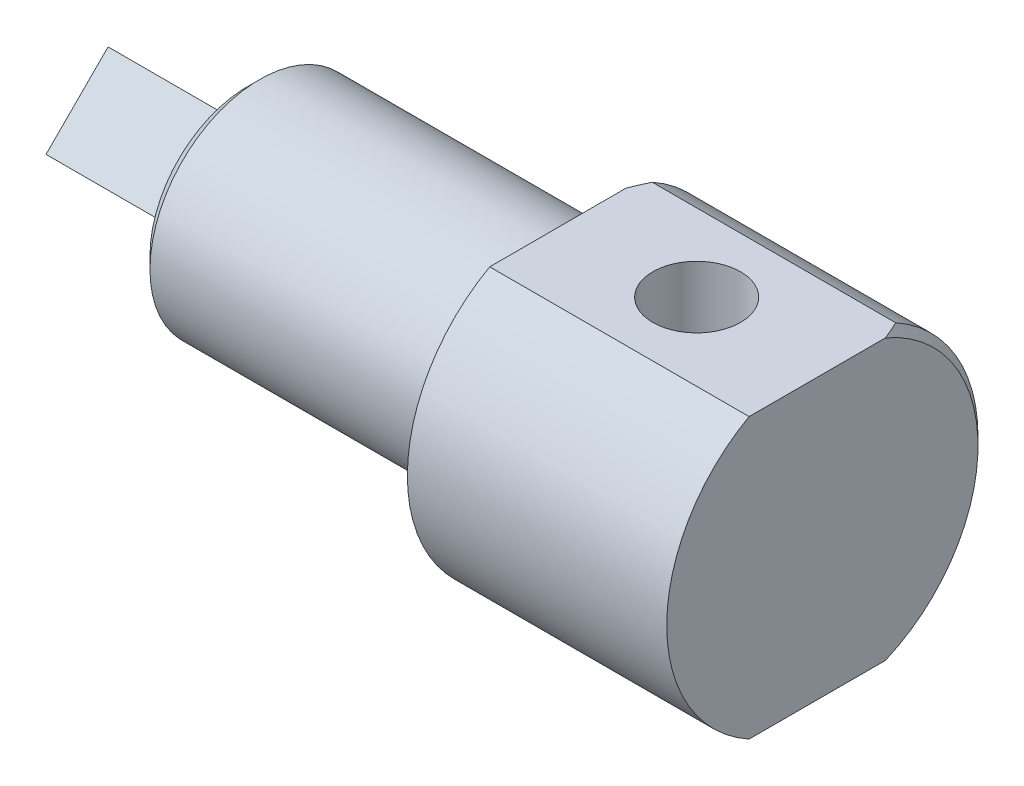
ISO-10303-21;
HEADER;
FILE_DESCRIPTION(('STEP AP214'),'2;1');
FILE_NAME('part.step','',(''),(''),'','','');
FILE_SCHEMA(('AUTOMOTIVE_DESIGN { 1 0 10303 214 1 1 1 1 }'));
ENDSEC;
DATA;
#1=APPLICATION_CONTEXT('core data for automotive mechanical design processes');
#2=APPLICATION_PROTOCOL_DEFINITION('international standard','automotive_design',2000,#1);
#3=PRODUCT_CONTEXT('',#1,'mechanical');
#4=PRODUCT('Part','Part','',(#3));
#5=PRODUCT_RELATED_PRODUCT_CATEGORY('part','',(#4));
#6=PRODUCT_DEFINITION_FORMATION('','',#4);
#7=PRODUCT_DEFINITION_CONTEXT('part definition',#1,'design');
#8=PRODUCT_DEFINITION('design','',#6,#7);
#9=PRODUCT_DEFINITION_SHAPE('','',#8);
#10=(LENGTH_UNIT() NAMED_UNIT(*) SI_UNIT(.MILLI.,.METRE.));
#11=(NAMED_UNIT(*) PLANE_ANGLE_UNIT() SI_UNIT($,.RADIAN.));
#12=(NAMED_UNIT(*) SI_UNIT($,.STERADIAN.) SOLID_ANGLE_UNIT());
#13=UNCERTAINTY_MEASURE_WITH_UNIT(LENGTH_MEASURE(1.E-05),#10,'distance_accuracy_value','');
#14=(GEOMETRIC_REPRESENTATION_CONTEXT(3) GLOBAL_UNCERTAINTY_ASSIGNED_CONTEXT((#13)) GLOBAL_UNIT_ASSIGNED_CONTEXT((#10,
#11,#12)) REPRESENTATION_CONTEXT('',''));
#15=CARTESIAN_POINT('',(0.,0.,0.));
#16=DIRECTION('',(0.,0.,1.));
#17=DIRECTION('',(1.,0.,0.));
#18=AXIS2_PLACEMENT_3D('',#15,#16,#17);
#19=CARTESIAN_POINT('',(0.,0.,0.));
#20=DIRECTION('',(1.,0.,0.));
#21=DIRECTION('',(0.,0.,-1.));
#22=AXIS2_PLACEMENT_3D('',#19,#20,#21);
#23=CYLINDRICAL_SURFACE('',#22,40.);
#24=DIRECTION('',(-1.,0.,0.));
#25=VECTOR('',#24,1.);
#26=CARTESIAN_POINT('',(489.715486354475,-35.,19.3649167310371));
#27=LINE('',#26,#25);
#28=CARTESIAN_POINT('',(145.,-35.,19.3649167310371));
#29=VERTEX_POINT('',#28);
#30=CARTESIAN_POINT('',(80.,-35.,19.3649167310371));
#31=VERTEX_POINT('',#30);
#32=EDGE_CURVE('E141',#29,#31,#27,.T.);
#33=ORIENTED_EDGE('',*,*,#32,.F.);
#34=CARTESIAN_POINT('',(145.,0.,0.));
#35=DIRECTION('',(1.,0.,0.));
#36=DIRECTION('',(0.,0.,-1.));
#37=AXIS2_PLACEMENT_3D('',#34,#35,#36);
#38=CIRCLE('',#37,40.);
#39=CARTESIAN_POINT('',(145.,35.,19.3649167310371));
#40=VERTEX_POINT('',#39);
#41=EDGE_CURVE('E151',#40,#29,#38,.T.);
#42=ORIENTED_EDGE('',*,*,#41,.F.);
#43=DIRECTION('',(-1.,0.,0.));
#44=VECTOR('',#43,1.);
#45=CARTESIAN_POINT('',(592.003645318366,35.,19.3649167310371));
#46=LINE('',#45,#44);
#47=CARTESIAN_POINT('',(80.0000000000002,35.,19.3649167310371));
#48=VERTEX_POINT('',#47);
#49=EDGE_CURVE('E172',#40,#48,#46,.T.);
#50=ORIENTED_EDGE('',*,*,#49,.T.);
#51=CARTESIAN_POINT('',(80.,0.,0.));
#52=DIRECTION('',(1.,0.,0.));
#53=DIRECTION('',(0.,0.,-1.));
#54=AXIS2_PLACEMENT_3D('',#51,#52,#53);
#55=CIRCLE('',#54,40.);
#56=EDGE_CURVE('E157',#48,#31,#55,.T.);
#57=ORIENTED_EDGE('',*,*,#56,.T.);
#58=EDGE_LOOP('',(#33,#42,#50,#57));
#59=FACE_BOUND('',#58,.T.);
#60=ADVANCED_FACE('F35',(#59),#23,.T.);
#61=CARTESIAN_POINT('',(80.,27.5,0.));
#62=DIRECTION('',(-1.,0.,0.));
#63=DIRECTION('',(0.,0.,1.));
#64=AXIS2_PLACEMENT_3D('',#61,#62,#63);
#65=PLANE('',#64);
#66=DIRECTION('',(0.,0.,-1.));
#67=VECTOR('',#66,1.);
#68=CARTESIAN_POINT('',(80.,35.,0.));
#69=LINE('',#68,#67);
#70=CARTESIAN_POINT('',(80.,35.,-14.7986485869487));
#71=VERTEX_POINT('',#70);
#72=EDGE_CURVE('E176',#48,#71,#69,.T.);
#73=ORIENTED_EDGE('',*,*,#72,.T.);
#74=CARTESIAN_POINT('',(80.,0.,0.));
#75=DIRECTION('',(-1.,0.,0.));
#76=DIRECTION('',(0.,0.,1.));
#77=AXIS2_PLACEMENT_3D('',#74,#75,#76);
#78=CIRCLE('',#77,38.);
#79=CARTESIAN_POINT('',(80.,-35.,-14.7986485869488));
#80=VERTEX_POINT('',#79);
#81=EDGE_CURVE('E50',#71,#80,#78,.T.);
#82=ORIENTED_EDGE('',*,*,#81,.T.);
#83=DIRECTION('',(0.,0.,-1.));
#84=VECTOR('',#83,1.);
#85=CARTESIAN_POINT('',(80.,-35.,0.));
#86=LINE('',#85,#84);
#87=EDGE_CURVE('E165',#31,#80,#86,.T.);
#88=ORIENTED_EDGE('',*,*,#87,.F.);
#89=ORIENTED_EDGE('',*,*,#56,.F.);
#90=EDGE_LOOP('',(#73,#82,#88,#89));
#91=FACE_BOUND('',#90,.T.);
#92=CARTESIAN_POINT('',(80.,0.,0.));
#93=DIRECTION('',(1.,0.,0.));
#94=DIRECTION('',(0.,0.,-1.));
#95=AXIS2_PLACEMENT_3D('',#92,#93,#94);
#96=CIRCLE('',#95,27.5);
#97=CARTESIAN_POINT('',(80.,0.,-27.5));
#98=VERTEX_POINT('',#97);
#99=EDGE_CURVE('E233',#98,#98,#96,.T.);
#100=ORIENTED_EDGE('',*,*,#99,.T.);
#101=EDGE_LOOP('',(#100));
#102=FACE_BOUND('',#101,.T.);
#103=ADVANCED_FACE('F301',(#91,#102),#65,.T.);
#104=DIRECTION('',(-1.,0.,0.));
#105=VECTOR('',#104,1.);
#106=CARTESIAN_POINT('',(592.003645318366,35.,-19.3649167310371));
#107=LINE('',#106,#105);
#108=CARTESIAN_POINT('',(143.,35.,-19.3649167310371));
#109=VERTEX_POINT('',#108);
#110=CARTESIAN_POINT('',(82.0000000000002,35.,-19.3649167310371));
#111=VERTEX_POINT('',#110);
#112=EDGE_CURVE('E173',#109,#111,#107,.T.);
#113=ORIENTED_EDGE('',*,*,#112,.F.);
#114=CARTESIAN_POINT('',(143.,0.,0.));
#115=DIRECTION('',(1.,0.,0.));
#116=DIRECTION('',(0.,0.,-1.));
#117=AXIS2_PLACEMENT_3D('',#114,#115,#116);
#118=CIRCLE('',#117,40.);
#119=CARTESIAN_POINT('',(143.,-35.,-19.3649167310371));
#120=VERTEX_POINT('',#119);
#121=EDGE_CURVE('E281',#109,#120,#118,.F.);
#122=ORIENTED_EDGE('',*,*,#121,.T.);
#123=DIRECTION('',(-1.,0.,0.));
#124=VECTOR('',#123,1.);
#125=CARTESIAN_POINT('',(489.715486354475,-35.,-19.3649167310371));
#126=LINE('',#125,#124);
#127=CARTESIAN_POINT('',(82.,-35.,-19.3649167310371));
#128=VERTEX_POINT('',#127);
#129=EDGE_CURVE('E162',#120,#128,#126,.T.);
#130=ORIENTED_EDGE('',*,*,#129,.T.);
#131=CARTESIAN_POINT('',(82.,0.,0.));
#132=DIRECTION('',(-1.,0.,0.));
#133=DIRECTION('',(0.,0.,1.));
#134=AXIS2_PLACEMENT_3D('',#131,#132,#133);
#135=CIRCLE('',#134,40.);
#136=EDGE_CURVE('E319',#128,#111,#135,.F.);
#137=ORIENTED_EDGE('',*,*,#136,.T.);
#138=EDGE_LOOP('',(#113,#122,#130,#137));
#139=FACE_BOUND('',#138,.T.);
#140=ADVANCED_FACE('F303',(#139),#23,.T.);
#141=CARTESIAN_POINT('',(145.,40.,0.));
#142=DIRECTION('',(1.,0.,0.));
#143=DIRECTION('',(0.,0.,-1.));
#144=AXIS2_PLACEMENT_3D('',#141,#142,#143);
#145=PLANE('',#144);
#146=DIRECTION('',(0.,0.,1.));
#147=VECTOR('',#146,1.);
#148=CARTESIAN_POINT('',(145.,-35.,0.));
#149=LINE('',#148,#147);
#150=CARTESIAN_POINT('',(145.,-35.,-14.7986485869487));
#151=VERTEX_POINT('',#150);
#152=EDGE_CURVE('E137',#151,#29,#149,.T.);
#153=ORIENTED_EDGE('',*,*,#152,.F.);
#154=CARTESIAN_POINT('',(145.,0.,0.));
#155=DIRECTION('',(1.,0.,0.));
#156=DIRECTION('',(0.,0.,-1.));
#157=AXIS2_PLACEMENT_3D('',#154,#155,#156);
#158=CIRCLE('',#157,38.);
#159=CARTESIAN_POINT('',(145.,35.,-14.7986485869487));
#160=VERTEX_POINT('',#159);
#161=EDGE_CURVE('E147',#151,#160,#158,.T.);
#162=ORIENTED_EDGE('',*,*,#161,.T.);
#163=DIRECTION('',(0.,0.,1.));
#164=VECTOR('',#163,1.);
#165=CARTESIAN_POINT('',(145.,35.,0.));
#166=LINE('',#165,#164);
#167=EDGE_CURVE('E148',#160,#40,#166,.T.);
#168=ORIENTED_EDGE('',*,*,#167,.T.);
#169=ORIENTED_EDGE('',*,*,#41,.T.);
#170=EDGE_LOOP('',(#153,#162,#168,#169));
#171=FACE_BOUND('',#170,.T.);
#172=ADVANCED_FACE('F152',(#171),#145,.T.);
#173=CARTESIAN_POINT('',(0.,0.,0.));
#174=DIRECTION('',(1.,0.,0.));
#175=DIRECTION('',(0.,0.,-1.));
#176=AXIS2_PLACEMENT_3D('',#173,#174,#175);
#177=CYLINDRICAL_SURFACE('',#176,27.5);
#178=CARTESIAN_POINT('',(3.00000000000004,0.,0.));
#179=DIRECTION('',(-1.,0.,0.));
#180=DIRECTION('',(0.,0.,1.));
#181=AXIS2_PLACEMENT_3D('',#178,#179,#180);
#182=CIRCLE('',#181,27.5);
#183=CARTESIAN_POINT('',(3.00000000000004,0.,27.5));
#184=VERTEX_POINT('',#183);
#185=EDGE_CURVE('E43',#184,#184,#182,.F.);
#186=ORIENTED_EDGE('',*,*,#185,.T.);
#187=EDGE_LOOP('',(#186));
#188=FACE_BOUND('',#187,.T.);
#189=ORIENTED_EDGE('',*,*,#99,.F.);
#190=EDGE_LOOP('',(#189));
#191=FACE_BOUND('',#190,.T.);
#192=CARTESIAN_POINT('',(15.,0.,0.));
#193=DIRECTION('',(-1.,0.,0.));
#194=DIRECTION('',(0.,0.,1.));
#195=AXIS2_PLACEMENT_3D('',#192,#193,#194);
#196=CIRCLE('',#195,27.5);
#197=CARTESIAN_POINT('',(15.,-8.,-26.3106442338457));
#198=VERTEX_POINT('',#197);
#199=CARTESIAN_POINT('',(15.,8.,-26.3106442338457));
#200=VERTEX_POINT('',#199);
#201=EDGE_CURVE('E240',#198,#200,#196,.F.);
#202=ORIENTED_EDGE('',*,*,#201,.F.);
#203=DIRECTION('',(1.,0.,0.));
#204=VECTOR('',#203,1.);
#205=CARTESIAN_POINT('',(0.,-8.,-26.3106442338457));
#206=LINE('',#205,#204);
#207=CARTESIAN_POINT('',(60.,-8.,-26.3106442338457));
#208=VERTEX_POINT('',#207);
#209=EDGE_CURVE('E243',#198,#208,#206,.T.);
#210=ORIENTED_EDGE('',*,*,#209,.T.);
#211=CARTESIAN_POINT('',(60.,0.,0.));
#212=DIRECTION('',(1.,0.,0.));
#213=DIRECTION('',(0.,0.,-1.));
#214=AXIS2_PLACEMENT_3D('',#211,#212,#213);
#215=CIRCLE('',#214,27.5);
#216=CARTESIAN_POINT('',(60.,8.,-26.3106442338457));
#217=VERTEX_POINT('',#216);
#218=EDGE_CURVE('E238',#217,#208,#215,.F.);
#219=ORIENTED_EDGE('',*,*,#218,.F.);
#220=DIRECTION('',(1.,0.,0.));
#221=VECTOR('',#220,1.);
#222=CARTESIAN_POINT('',(0.,8.,-26.3106442338457));
#223=LINE('',#222,#221);
#224=EDGE_CURVE('E236',#200,#217,#223,.T.);
#225=ORIENTED_EDGE('',*,*,#224,.F.);
#226=EDGE_LOOP('',(#202,#210,#219,#225));
#227=FACE_BOUND('',#226,.T.);
#228=ADVANCED_FACE('F314',(#188,#191,#227),#177,.T.);
#229=CARTESIAN_POINT('',(0.,0.,0.));
#230=DIRECTION('',(-1.,0.,0.));
#231=DIRECTION('',(0.,0.,1.));
#232=AXIS2_PLACEMENT_3D('',#229,#230,#231);
#233=PLANE('',#232);
#234=CARTESIAN_POINT('',(0.,0.,0.));
#235=DIRECTION('',(-1.,0.,0.));
#236=DIRECTION('',(0.,0.,1.));
#237=AXIS2_PLACEMENT_3D('',#234,#235,#236);
#238=CIRCLE('',#237,24.5);
#239=CARTESIAN_POINT('',(0.,0.,24.5));
#240=VERTEX_POINT('',#239);
#241=EDGE_CURVE('E11',#240,#240,#238,.T.);
#242=ORIENTED_EDGE('',*,*,#241,.T.);
#243=EDGE_LOOP('',(#242));
#244=FACE_BOUND('',#243,.T.);
#245=DIRECTION('',(0.,0.707106781186548,0.707106781186547));
#246=VECTOR('',#245,1.);
#247=CARTESIAN_POINT('',(0.,-15.556349186104,0.));
#248=LINE('',#247,#246);
#249=CARTESIAN_POINT('',(0.,-15.556349186104,0.));
#250=VERTEX_POINT('',#249);
#251=CARTESIAN_POINT('',(0.,0.,15.556349186104));
#252=VERTEX_POINT('',#251);
#253=EDGE_CURVE('E198',#250,#252,#248,.T.);
#254=ORIENTED_EDGE('',*,*,#253,.F.);
#255=DIRECTION('',(0.,-0.707106781186547,0.707106781186548));
#256=VECTOR('',#255,1.);
#257=CARTESIAN_POINT('',(0.,-15.556349186104,0.));
#258=LINE('',#257,#256);
#259=CARTESIAN_POINT('',(0.,0.,-15.556349186104));
#260=VERTEX_POINT('',#259);
#261=EDGE_CURVE('E205',#260,#250,#258,.T.);
#262=ORIENTED_EDGE('',*,*,#261,.F.);
#263=DIRECTION('',(0.,-0.707106781186548,-0.707106781186548));
#264=VECTOR('',#263,1.);
#265=CARTESIAN_POINT('',(0.,0.,-15.556349186104));
#266=LINE('',#265,#264);
#267=CARTESIAN_POINT('',(0.,15.5563491861041,0.));
#268=VERTEX_POINT('',#267);
#269=EDGE_CURVE('E217',#268,#260,#266,.T.);
#270=ORIENTED_EDGE('',*,*,#269,.F.);
#271=DIRECTION('',(0.,0.707106781186547,-0.707106781186548));
#272=VECTOR('',#271,1.);
#273=CARTESIAN_POINT('',(0.,0.,15.556349186104));
#274=LINE('',#273,#272);
#275=EDGE_CURVE('E214',#252,#268,#274,.T.);
#276=ORIENTED_EDGE('',*,*,#275,.F.);
#277=EDGE_LOOP('',(#254,#262,#270,#276));
#278=FACE_BOUND('',#277,.T.);
#279=ADVANCED_FACE('F333',(#244,#278),#233,.T.);
#280=CARTESIAN_POINT('',(-35.,-15.556349186104,0.));
#281=DIRECTION('',(0.,0.707106781186548,-0.707106781186548));
#282=DIRECTION('',(0.,0.707106781186548,0.707106781186547));
#283=AXIS2_PLACEMENT_3D('',#280,#281,#282);
#284=PLANE('',#283);
#285=ORIENTED_EDGE('',*,*,#253,.T.);
#286=DIRECTION('',(1.,0.,0.));
#287=VECTOR('',#286,1.);
#288=CARTESIAN_POINT('',(-35.,0.,15.556349186104));
#289=LINE('',#288,#287);
#290=CARTESIAN_POINT('',(-35.,0.,15.556349186104));
#291=VERTEX_POINT('',#290);
#292=EDGE_CURVE('E158',#291,#252,#289,.T.);
#293=ORIENTED_EDGE('',*,*,#292,.F.);
#294=DIRECTION('',(0.,0.707106781186548,0.707106781186547));
#295=VECTOR('',#294,1.);
#296=CARTESIAN_POINT('',(-35.,-15.556349186104,0.));
#297=LINE('',#296,#295);
#298=CARTESIAN_POINT('',(-35.,-15.556349186104,0.));
#299=VERTEX_POINT('',#298);
#300=EDGE_CURVE('E201',#299,#291,#297,.T.);
#301=ORIENTED_EDGE('',*,*,#300,.F.);
#302=DIRECTION('',(1.,0.,0.));
#303=VECTOR('',#302,1.);
#304=CARTESIAN_POINT('',(-35.,-15.556349186104,0.));
#305=LINE('',#304,#303);
#306=EDGE_CURVE('E211',#299,#250,#305,.T.);
#307=ORIENTED_EDGE('',*,*,#306,.T.);
#308=EDGE_LOOP('',(#285,#293,#301,#307));
#309=FACE_BOUND('',#308,.T.);
#310=ADVANCED_FACE('F336',(#309),#284,.F.);
#311=CARTESIAN_POINT('',(-35.,0.,15.556349186104));
#312=DIRECTION('',(0.,-0.707106781186548,-0.707106781186547));
#313=DIRECTION('',(0.,0.707106781186547,-0.707106781186548));
#314=AXIS2_PLACEMENT_3D('',#311,#312,#313);
#315=PLANE('',#314);
#316=ORIENTED_EDGE('',*,*,#275,.T.);
#317=DIRECTION('',(1.,0.,0.));
#318=VECTOR('',#317,1.);
#319=CARTESIAN_POINT('',(-35.,15.5563491861041,0.));
#320=LINE('',#319,#318);
#321=CARTESIAN_POINT('',(-35.,15.5563491861041,0.));
#322=VERTEX_POINT('',#321);
#323=EDGE_CURVE('E227',#322,#268,#320,.T.);
#324=ORIENTED_EDGE('',*,*,#323,.F.);
#325=DIRECTION('',(0.,0.707106781186547,-0.707106781186548));
#326=VECTOR('',#325,1.);
#327=CARTESIAN_POINT('',(-35.,0.,15.556349186104));
#328=LINE('',#327,#326);
#329=EDGE_CURVE('E204',#291,#322,#328,.T.);
#330=ORIENTED_EDGE('',*,*,#329,.F.);
#331=ORIENTED_EDGE('',*,*,#292,.T.);
#332=EDGE_LOOP('',(#316,#324,#330,#331));
#333=FACE_BOUND('',#332,.T.);
#334=ADVANCED_FACE('F352',(#333),#315,.F.);
#335=CARTESIAN_POINT('',(-35.,0.,-15.556349186104));
#336=DIRECTION('',(0.,-0.707106781186548,0.707106781186548));
#337=DIRECTION('',(0.,-0.707106781186548,-0.707106781186548));
#338=AXIS2_PLACEMENT_3D('',#335,#336,#337);
#339=PLANE('',#338);
#340=ORIENTED_EDGE('',*,*,#269,.T.);
#341=DIRECTION('',(1.,0.,0.));
#342=VECTOR('',#341,1.);
#343=CARTESIAN_POINT('',(-35.,0.,-15.556349186104));
#344=LINE('',#343,#342);
#345=CARTESIAN_POINT('',(-35.,0.,-15.556349186104));
#346=VERTEX_POINT('',#345);
#347=EDGE_CURVE('E224',#346,#260,#344,.T.);
#348=ORIENTED_EDGE('',*,*,#347,.F.);
#349=DIRECTION('',(0.,-0.707106781186548,-0.707106781186548));
#350=VECTOR('',#349,1.);
#351=CARTESIAN_POINT('',(-35.,0.,-15.556349186104));
#352=LINE('',#351,#350);
#353=EDGE_CURVE('E207',#322,#346,#352,.T.);
#354=ORIENTED_EDGE('',*,*,#353,.F.);
#355=ORIENTED_EDGE('',*,*,#323,.T.);
#356=EDGE_LOOP('',(#340,#348,#354,#355));
#357=FACE_BOUND('',#356,.T.);
#358=ADVANCED_FACE('F350',(#357),#339,.F.);
#359=CARTESIAN_POINT('',(-35.,-15.556349186104,0.));
#360=DIRECTION('',(0.,0.707106781186548,0.707106781186547));
#361=DIRECTION('',(0.,-0.707106781186547,0.707106781186548));
#362=AXIS2_PLACEMENT_3D('',#359,#360,#361);
#363=PLANE('',#362);
#364=ORIENTED_EDGE('',*,*,#261,.T.);
#365=ORIENTED_EDGE('',*,*,#306,.F.);
#366=DIRECTION('',(0.,-0.707106781186547,0.707106781186548));
#367=VECTOR('',#366,1.);
#368=CARTESIAN_POINT('',(-35.,-15.556349186104,0.));
#369=LINE('',#368,#367);
#370=EDGE_CURVE('E209',#346,#299,#369,.T.);
#371=ORIENTED_EDGE('',*,*,#370,.F.);
#372=ORIENTED_EDGE('',*,*,#347,.T.);
#373=EDGE_LOOP('',(#364,#365,#371,#372));
#374=FACE_BOUND('',#373,.T.);
#375=ADVANCED_FACE('F341',(#374),#363,.F.);
#376=CARTESIAN_POINT('',(-35.,0.,0.));
#377=DIRECTION('',(-1.,0.,0.));
#378=DIRECTION('',(0.,0.,1.));
#379=AXIS2_PLACEMENT_3D('',#376,#377,#378);
#380=PLANE('',#379);
#381=ORIENTED_EDGE('',*,*,#300,.T.);
#382=ORIENTED_EDGE('',*,*,#329,.T.);
#383=ORIENTED_EDGE('',*,*,#353,.T.);
#384=ORIENTED_EDGE('',*,*,#370,.T.);
#385=EDGE_LOOP('',(#381,#382,#383,#384));
#386=FACE_BOUND('',#385,.T.);
#387=ADVANCED_FACE('F346',(#386),#380,.T.);
#388=CARTESIAN_POINT('',(15.,-8.,-27.5));
#389=DIRECTION('',(-1.,0.,0.));
#390=DIRECTION('',(0.,0.,1.));
#391=AXIS2_PLACEMENT_3D('',#388,#389,#390);
#392=PLANE('',#391);
#393=DIRECTION('',(0.,0.,1.));
#394=VECTOR('',#393,1.);
#395=CARTESIAN_POINT('',(15.,-8.,-27.5));
#396=LINE('',#395,#394);
#397=CARTESIAN_POINT('',(15.,-8.,-22.5));
#398=VERTEX_POINT('',#397);
#399=EDGE_CURVE('E180',#198,#398,#396,.T.);
#400=ORIENTED_EDGE('',*,*,#399,.F.);
#401=ORIENTED_EDGE('',*,*,#201,.T.);
#402=DIRECTION('',(0.,0.,1.));
#403=VECTOR('',#402,1.);
#404=CARTESIAN_POINT('',(15.,8.,-27.5));
#405=LINE('',#404,#403);
#406=CARTESIAN_POINT('',(15.,8.,-22.5));
#407=VERTEX_POINT('',#406);
#408=EDGE_CURVE('E179',#200,#407,#405,.T.);
#409=ORIENTED_EDGE('',*,*,#408,.T.);
#410=DIRECTION('',(0.,1.,0.));
#411=VECTOR('',#410,1.);
#412=CARTESIAN_POINT('',(15.,-8.,-22.5));
#413=LINE('',#412,#411);
#414=EDGE_CURVE('E189',#398,#407,#413,.T.);
#415=ORIENTED_EDGE('',*,*,#414,.F.);
#416=EDGE_LOOP('',(#400,#401,#409,#415));
#417=FACE_BOUND('',#416,.T.);
#418=ADVANCED_FACE('F366',(#417),#392,.F.);
#419=CARTESIAN_POINT('',(60.,-8.,-27.5));
#420=DIRECTION('',(1.,0.,0.));
#421=DIRECTION('',(0.,0.,-1.));
#422=AXIS2_PLACEMENT_3D('',#419,#420,#421);
#423=PLANE('',#422);
#424=ORIENTED_EDGE('',*,*,#218,.T.);
#425=DIRECTION('',(0.,0.,-1.));
#426=VECTOR('',#425,1.);
#427=CARTESIAN_POINT('',(60.,-8.,-27.5));
#428=LINE('',#427,#426);
#429=CARTESIAN_POINT('',(60.,-8.,-22.5));
#430=VERTEX_POINT('',#429);
#431=EDGE_CURVE('E186',#430,#208,#428,.T.);
#432=ORIENTED_EDGE('',*,*,#431,.F.);
#433=DIRECTION('',(0.,1.,0.));
#434=VECTOR('',#433,1.);
#435=CARTESIAN_POINT('',(60.,-8.,-22.5));
#436=LINE('',#435,#434);
#437=CARTESIAN_POINT('',(60.,8.,-22.5));
#438=VERTEX_POINT('',#437);
#439=EDGE_CURVE('E196',#430,#438,#436,.T.);
#440=ORIENTED_EDGE('',*,*,#439,.T.);
#441=DIRECTION('',(0.,0.,-1.));
#442=VECTOR('',#441,1.);
#443=CARTESIAN_POINT('',(60.,8.,-27.5));
#444=LINE('',#443,#442);
#445=EDGE_CURVE('E183',#438,#217,#444,.T.);
#446=ORIENTED_EDGE('',*,*,#445,.T.);
#447=EDGE_LOOP('',(#424,#432,#440,#446));
#448=FACE_BOUND('',#447,.T.);
#449=ADVANCED_FACE('F369',(#448),#423,.F.);
#450=CARTESIAN_POINT('',(15.,-8.,-22.5));
#451=DIRECTION('',(0.,0.,1.));
#452=DIRECTION('',(1.,0.,0.));
#453=AXIS2_PLACEMENT_3D('',#450,#451,#452);
#454=PLANE('',#453);
#455=DIRECTION('',(1.,0.,0.));
#456=VECTOR('',#455,1.);
#457=CARTESIAN_POINT('',(15.,8.,-22.5));
#458=LINE('',#457,#456);
#459=EDGE_CURVE('E191',#407,#438,#458,.T.);
#460=ORIENTED_EDGE('',*,*,#459,.T.);
#461=ORIENTED_EDGE('',*,*,#439,.F.);
#462=DIRECTION('',(1.,0.,0.));
#463=VECTOR('',#462,1.);
#464=CARTESIAN_POINT('',(15.,-8.,-22.5));
#465=LINE('',#464,#463);
#466=EDGE_CURVE('E182',#398,#430,#465,.T.);
#467=ORIENTED_EDGE('',*,*,#466,.F.);
#468=ORIENTED_EDGE('',*,*,#414,.T.);
#469=EDGE_LOOP('',(#460,#461,#467,#468));
#470=FACE_BOUND('',#469,.T.);
#471=ADVANCED_FACE('F371',(#470),#454,.F.);
#472=CARTESIAN_POINT('',(0.,-8.,0.));
#473=DIRECTION('',(0.,1.,0.));
#474=DIRECTION('',(0.,0.,1.));
#475=AXIS2_PLACEMENT_3D('',#472,#473,#474);
#476=PLANE('',#475);
#477=ORIENTED_EDGE('',*,*,#399,.T.);
#478=ORIENTED_EDGE('',*,*,#466,.T.);
#479=ORIENTED_EDGE('',*,*,#431,.T.);
#480=ORIENTED_EDGE('',*,*,#209,.F.);
#481=EDGE_LOOP('',(#477,#478,#479,#480));
#482=FACE_BOUND('',#481,.T.);
#483=ADVANCED_FACE('F374',(#482),#476,.T.);
#484=CARTESIAN_POINT('',(0.,8.,0.));
#485=DIRECTION('',(0.,1.,0.));
#486=DIRECTION('',(0.,0.,1.));
#487=AXIS2_PLACEMENT_3D('',#484,#485,#486);
#488=PLANE('',#487);
#489=ORIENTED_EDGE('',*,*,#224,.T.);
#490=ORIENTED_EDGE('',*,*,#445,.F.);
#491=ORIENTED_EDGE('',*,*,#459,.F.);
#492=ORIENTED_EDGE('',*,*,#408,.F.);
#493=EDGE_LOOP('',(#489,#490,#491,#492));
#494=FACE_BOUND('',#493,.T.);
#495=ADVANCED_FACE('F379',(#494),#488,.F.);
#496=CARTESIAN_POINT('',(592.003645318366,35.,19.3649167310371));
#497=DIRECTION('',(0.,1.,0.));
#498=DIRECTION('',(0.,0.,1.));
#499=AXIS2_PLACEMENT_3D('',#496,#497,#498);
#500=PLANE('',#499);
#501=CARTESIAN_POINT('',(112.5,35.,0.));
#502=DIRECTION('',(0.,1.,0.));
#503=DIRECTION('',(0.,0.,1.));
#504=AXIS2_PLACEMENT_3D('',#501,#502,#503);
#505=CIRCLE('',#504,11.);
#506=CARTESIAN_POINT('',(112.5,35.,11.));
#507=VERTEX_POINT('',#506);
#508=EDGE_CURVE('E163',#507,#507,#505,.T.);
#509=ORIENTED_EDGE('',*,*,#508,.F.);
#510=EDGE_LOOP('',(#509));
#511=FACE_BOUND('',#510,.T.);
#512=ORIENTED_EDGE('',*,*,#167,.F.);
#513=CARTESIAN_POINT('',(145.,35.,-14.7986485869487));
#514=CARTESIAN_POINT('',(144.849169519311,35.,-15.1859422875163));
#515=CARTESIAN_POINT('',(144.693988290972,35.,-15.571528147454));
#516=CARTESIAN_POINT('',(144.375566531998,35.,-16.3391815817764));
#517=CARTESIAN_POINT('',(144.212329203032,35.,-16.7212504833791));
#518=CARTESIAN_POINT('',(143.878323089944,35.,-17.4820601770437));
#519=CARTESIAN_POINT('',(143.707554554256,35.,-17.8608010783944));
#520=CARTESIAN_POINT('',(143.3589401344,35.,-18.6151946039658));
#521=CARTESIAN_POINT('',(143.181091485514,35.,-18.9908459512693));
#522=CARTESIAN_POINT('',(143.,35.,-19.3649167310371));
#523=B_SPLINE_CURVE_WITH_KNOTS('',3,(#513,#514,#515,#516,#517,#518,#519,#520,#521,#522),
.UNSPECIFIED.,.F.,.F.,(4,2,2,2,4),(0.,1.24683830785545,2.49318502387619,3.7394906567694,
4.98628782779644),.UNSPECIFIED.);
#524=EDGE_CURVE('E255',#160,#109,#523,.T.);
#525=ORIENTED_EDGE('',*,*,#524,.T.);
#526=ORIENTED_EDGE('',*,*,#112,.T.);
#527=CARTESIAN_POINT('',(82.,35.,-19.3649167310371));
#528=CARTESIAN_POINT('',(81.8189085144856,35.,-18.9908459512694));
#529=CARTESIAN_POINT('',(81.6410598656004,35.,-18.6151946039658));
#530=CARTESIAN_POINT('',(81.2924454457437,35.,-17.8608010783945));
#531=CARTESIAN_POINT('',(81.121676910056,35.,-17.4820601770437));
#532=CARTESIAN_POINT('',(80.7876707969675,35.,-16.7212504833791));
#533=CARTESIAN_POINT('',(80.6244334680023,35.,-16.3391815817764));
#534=CARTESIAN_POINT('',(80.3060117090283,35.,-15.571528147454));
#535=CARTESIAN_POINT('',(80.1508304806893,35.,-15.1859422875163));
#536=CARTESIAN_POINT('',(80.,35.,-14.7986485869488));
#537=B_SPLINE_CURVE_WITH_KNOTS('',3,(#527,#528,#529,#530,#531,#532,#533,#534,#535,#536),
.UNSPECIFIED.,.F.,.F.,(4,2,2,2,4),(0.,1.24679717102704,2.49310280392024,3.73944951994099,
4.98628782779643),.UNSPECIFIED.);
#538=EDGE_CURVE('E248',#111,#71,#537,.T.);
#539=ORIENTED_EDGE('',*,*,#538,.T.);
#540=ORIENTED_EDGE('',*,*,#72,.F.);
#541=ORIENTED_EDGE('',*,*,#49,.F.);
#542=EDGE_LOOP('',(#512,#525,#526,#539,#540,#541));
#543=FACE_BOUND('',#542,.T.);
#544=ADVANCED_FACE('F262',(#511,#543),#500,.T.);
#545=CARTESIAN_POINT('',(489.715486354475,-35.,19.3649167310371));
#546=DIRECTION('',(0.,1.,0.));
#547=DIRECTION('',(0.,0.,1.));
#548=AXIS2_PLACEMENT_3D('',#545,#546,#547);
#549=PLANE('',#548);
#550=CARTESIAN_POINT('',(112.5,-35.,0.));
#551=DIRECTION('',(0.,1.,0.));
#552=DIRECTION('',(0.,0.,1.));
#553=AXIS2_PLACEMENT_3D('',#550,#551,#552);
#554=CIRCLE('',#553,11.);
#555=CARTESIAN_POINT('',(112.5,-35.,11.));
#556=VERTEX_POINT('',#555);
#557=EDGE_CURVE('E168',#556,#556,#554,.T.);
#558=ORIENTED_EDGE('',*,*,#557,.T.);
#559=EDGE_LOOP('',(#558));
#560=FACE_BOUND('',#559,.T.);
#561=ORIENTED_EDGE('',*,*,#129,.F.);
#562=CARTESIAN_POINT('',(143.,-35.,-19.3649167310371));
#563=CARTESIAN_POINT('',(143.181091485514,-35.,-18.9908459512694));
#564=CARTESIAN_POINT('',(143.3589401344,-35.,-18.6151946039658));
#565=CARTESIAN_POINT('',(143.707554554256,-35.,-17.8608010783945));
#566=CARTESIAN_POINT('',(143.878323089944,-35.,-17.4820601770437));
#567=CARTESIAN_POINT('',(144.212329203032,-35.,-16.7212504833791));
#568=CARTESIAN_POINT('',(144.375566531998,-35.,-16.3391815817764));
#569=CARTESIAN_POINT('',(144.693988290972,-35.,-15.571528147454));
#570=CARTESIAN_POINT('',(144.849169519311,-35.,-15.1859422875163));
#571=CARTESIAN_POINT('',(145.,-35.,-14.7986485869487));
#572=B_SPLINE_CURVE_WITH_KNOTS('',3,(#562,#563,#564,#565,#566,#567,#568,#569,#570,#571),
.UNSPECIFIED.,.F.,.F.,(4,2,2,2,4),(0.,1.24679717102704,2.49310280392025,3.739449519941,
4.98628782779645),.UNSPECIFIED.);
#573=EDGE_CURVE('E143',#120,#151,#572,.T.);
#574=ORIENTED_EDGE('',*,*,#573,.T.);
#575=ORIENTED_EDGE('',*,*,#152,.T.);
#576=ORIENTED_EDGE('',*,*,#32,.T.);
#577=ORIENTED_EDGE('',*,*,#87,.T.);
#578=CARTESIAN_POINT('',(80.,-35.,-14.7986485869488));
#579=CARTESIAN_POINT('',(80.1508304806893,-35.,-15.1859422875163));
#580=CARTESIAN_POINT('',(80.3060117090283,-35.,-15.571528147454));
#581=CARTESIAN_POINT('',(80.6244334680023,-35.,-16.3391815817764));
#582=CARTESIAN_POINT('',(80.7876707969675,-35.,-16.7212504833791));
#583=CARTESIAN_POINT('',(81.121676910056,-35.,-17.4820601770437));
#584=CARTESIAN_POINT('',(81.2924454457437,-35.,-17.8608010783945));
#585=CARTESIAN_POINT('',(81.6410598656004,-35.,-18.6151946039658));
#586=CARTESIAN_POINT('',(81.8189085144856,-35.,-18.9908459512694));
#587=CARTESIAN_POINT('',(82.,-35.,-19.3649167310371));
#588=B_SPLINE_CURVE_WITH_KNOTS('',3,(#578,#579,#580,#581,#582,#583,#584,#585,#586,#587),
.UNSPECIFIED.,.F.,.F.,(4,2,2,2,4),(0.,1.24683830785544,2.49318502387618,3.73949065676938,
4.98628782779641),.UNSPECIFIED.);
#589=EDGE_CURVE('E57',#80,#128,#588,.T.);
#590=ORIENTED_EDGE('',*,*,#589,.T.);
#591=EDGE_LOOP('',(#561,#574,#575,#576,#577,#590));
#592=FACE_BOUND('',#591,.T.);
#593=ADVANCED_FACE('F139',(#560,#592),#549,.F.);
#594=CARTESIAN_POINT('',(112.5,-35.,0.));
#595=DIRECTION('',(0.,1.,0.));
#596=DIRECTION('',(0.,0.,1.));
#597=AXIS2_PLACEMENT_3D('',#594,#595,#596);
#598=CYLINDRICAL_SURFACE('',#597,11.);
#599=ORIENTED_EDGE('',*,*,#508,.T.);
#600=EDGE_LOOP('',(#599));
#601=FACE_BOUND('',#600,.T.);
#602=ORIENTED_EDGE('',*,*,#557,.F.);
#603=EDGE_LOOP('',(#602));
#604=FACE_BOUND('',#603,.T.);
#605=ADVANCED_FACE('F290',(#601,#604),#598,.F.);
#606=CARTESIAN_POINT('',(145.,0.,0.));
#607=DIRECTION('',(-1.,0.,0.));
#608=DIRECTION('',(0.,0.,1.));
#609=AXIS2_PLACEMENT_3D('',#606,#607,#608);
#610=CONICAL_SURFACE('',#609,38.,0.785398163397448);
#611=ORIENTED_EDGE('',*,*,#573,.F.);
#612=ORIENTED_EDGE('',*,*,#121,.F.);
#613=ORIENTED_EDGE('',*,*,#524,.F.);
#614=ORIENTED_EDGE('',*,*,#161,.F.);
#615=EDGE_LOOP('',(#611,#612,#613,#614));
#616=FACE_BOUND('',#615,.T.);
#617=ADVANCED_FACE('F269',(#616),#610,.T.);
#618=CARTESIAN_POINT('',(82.,0.,0.));
#619=DIRECTION('',(1.,0.,0.));
#620=DIRECTION('',(0.,0.,-1.));
#621=AXIS2_PLACEMENT_3D('',#618,#619,#620);
#622=CONICAL_SURFACE('',#621,40.,0.785398163397455);
#623=ORIENTED_EDGE('',*,*,#589,.F.);
#624=ORIENTED_EDGE('',*,*,#81,.F.);
#625=ORIENTED_EDGE('',*,*,#538,.F.);
#626=ORIENTED_EDGE('',*,*,#136,.F.);
#627=EDGE_LOOP('',(#623,#624,#625,#626));
#628=FACE_BOUND('',#627,.T.);
#629=ADVANCED_FACE('F266',(#628),#622,.T.);
#630=CARTESIAN_POINT('',(3.00000000000004,0.,0.));
#631=DIRECTION('',(1.,0.,0.));
#632=DIRECTION('',(0.,0.,-1.));
#633=AXIS2_PLACEMENT_3D('',#630,#631,#632);
#634=CONICAL_SURFACE('',#633,27.5,0.785398163397448);
#635=ORIENTED_EDGE('',*,*,#241,.F.);
#636=EDGE_LOOP('',(#635));
#637=FACE_BOUND('',#636,.T.);
#638=ORIENTED_EDGE('',*,*,#185,.F.);
#639=EDGE_LOOP('',(#638));
#640=FACE_BOUND('',#639,.T.);
#641=ADVANCED_FACE('F37',(#637,#640),#634,.T.);
#642=CLOSED_SHELL('',(#60,#103,#140,#172,#228,#279,#310,#334,#358,#375,#387,#418,#449,#471,#483,
#495,#544,#593,#605,#617,#629,#641));
#643=MANIFOLD_SOLID_BREP('B2',#642);
#644=ADVANCED_BREP_SHAPE_REPRESENTATION('',(#18,#643),#14);
#645=SHAPE_DEFINITION_REPRESENTATION(#9,#644);
ENDSEC;
END-ISO-10303-21;
